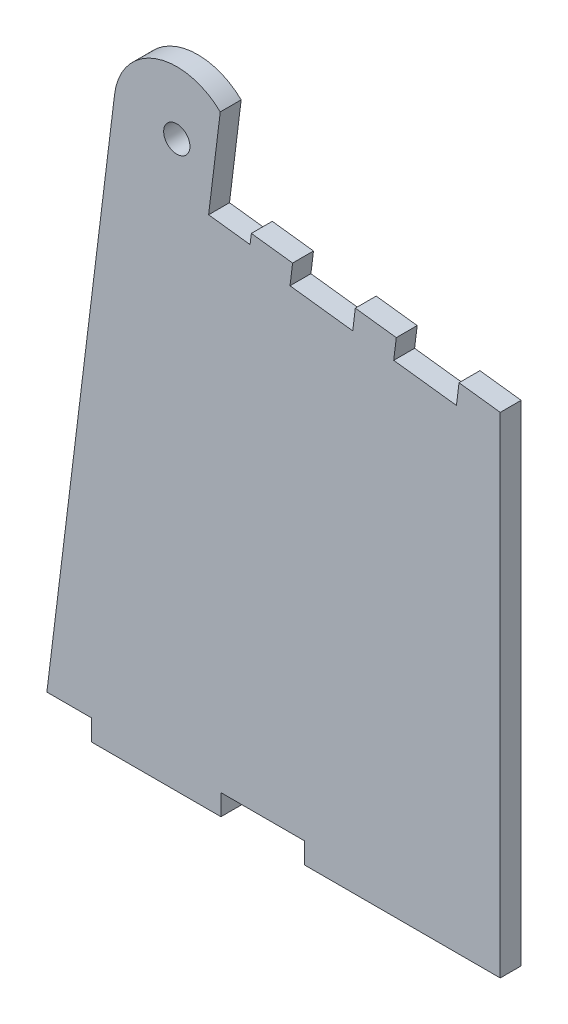
ISO-10303-21;
HEADER;
FILE_DESCRIPTION(('STEP AP214'),'2;1');
FILE_NAME('part.step','',(''),(''),'','','');
FILE_SCHEMA(('AUTOMOTIVE_DESIGN { 1 0 10303 214 1 1 1 1 }'));
ENDSEC;
DATA;
#1=APPLICATION_CONTEXT('core data for automotive mechanical design processes');
#2=APPLICATION_PROTOCOL_DEFINITION('international standard','automotive_design',2000,#1);
#3=PRODUCT_CONTEXT('',#1,'mechanical');
#4=PRODUCT('Part','Part','',(#3));
#5=PRODUCT_RELATED_PRODUCT_CATEGORY('part','',(#4));
#6=PRODUCT_DEFINITION_FORMATION('','',#4);
#7=PRODUCT_DEFINITION_CONTEXT('part definition',#1,'design');
#8=PRODUCT_DEFINITION('design','',#6,#7);
#9=PRODUCT_DEFINITION_SHAPE('','',#8);
#10=(LENGTH_UNIT() NAMED_UNIT(*) SI_UNIT(.MILLI.,.METRE.));
#11=(NAMED_UNIT(*) PLANE_ANGLE_UNIT() SI_UNIT($,.RADIAN.));
#12=(NAMED_UNIT(*) SI_UNIT($,.STERADIAN.) SOLID_ANGLE_UNIT());
#13=UNCERTAINTY_MEASURE_WITH_UNIT(LENGTH_MEASURE(1.E-05),#10,'distance_accuracy_value','');
#14=(GEOMETRIC_REPRESENTATION_CONTEXT(3) GLOBAL_UNCERTAINTY_ASSIGNED_CONTEXT((#13)) GLOBAL_UNIT_ASSIGNED_CONTEXT((#10,
#11,#12)) REPRESENTATION_CONTEXT('',''));
#15=CARTESIAN_POINT('',(0.,0.,0.));
#16=DIRECTION('',(0.,0.,1.));
#17=DIRECTION('',(1.,0.,0.));
#18=AXIS2_PLACEMENT_3D('',#15,#16,#17);
#19=CARTESIAN_POINT('',(-3.24017424080593,0.397843371406262,6.35));
#20=DIRECTION('',(0.992546151641322,-0.121869343405149,0.));
#21=DIRECTION('',(0.121869343405149,0.992546151641322,0.));
#22=AXIS2_PLACEMENT_3D('',#19,#20,#21);
#23=PLANE('',#22);
#24=DIRECTION('',(-0.121869343405149,-0.992546151641322,0.));
#25=VECTOR('',#24,1.);
#26=CARTESIAN_POINT('',(-3.24017424080593,0.397843371406262,0.));
#27=LINE('',#26,#25);
#28=CARTESIAN_POINT('',(19.4740695694599,185.390513811687,0.));
#29=VERTEX_POINT('',#28);
#30=CARTESIAN_POINT('',(15.9319371033892,156.542159914232,0.));
#31=VERTEX_POINT('',#30);
#32=EDGE_CURVE('E227',#29,#31,#27,.T.);
#33=ORIENTED_EDGE('',*,*,#32,.F.);
#34=DIRECTION('',(0.,0.,-1.));
#35=VECTOR('',#34,1.);
#36=CARTESIAN_POINT('',(19.4740695694599,185.390513811687,6.35));
#37=LINE('',#36,#35);
#38=CARTESIAN_POINT('',(19.4740695694599,185.390513811687,6.35));
#39=VERTEX_POINT('',#38);
#40=EDGE_CURVE('E12',#39,#29,#37,.T.);
#41=ORIENTED_EDGE('',*,*,#40,.F.);
#42=DIRECTION('',(-0.121869343405149,-0.992546151641322,0.));
#43=VECTOR('',#42,1.);
#44=CARTESIAN_POINT('',(-3.24017424080593,0.397843371406262,6.35));
#45=LINE('',#44,#43);
#46=CARTESIAN_POINT('',(15.9319371033892,156.542159914232,6.35));
#47=VERTEX_POINT('',#46);
#48=EDGE_CURVE('E421',#39,#47,#45,.T.);
#49=ORIENTED_EDGE('',*,*,#48,.T.);
#50=DIRECTION('',(0.,0.,-1.));
#51=VECTOR('',#50,1.);
#52=CARTESIAN_POINT('',(15.9319371033892,156.542159914232,6.35));
#53=LINE('',#52,#51);
#54=EDGE_CURVE('E59',#47,#31,#53,.T.);
#55=ORIENTED_EDGE('',*,*,#54,.T.);
#56=EDGE_LOOP('',(#33,#41,#49,#55));
#57=FACE_BOUND('',#56,.T.);
#58=ADVANCED_FACE('F42',(#57),#23,.T.);
#59=CARTESIAN_POINT('',(6.27197826270509,171.657077055794,6.35));
#60=DIRECTION('',(0.,0.,-1.));
#61=DIRECTION('',(-1.,0.,0.));
#62=AXIS2_PLACEMENT_3D('',#59,#60,#61);
#63=CYLINDRICAL_SURFACE('',#62,19.05);
#64=CARTESIAN_POINT('',(6.27197826270509,171.657077055794,0.));
#65=DIRECTION('',(0.,0.,1.));
#66=DIRECTION('',(1.,0.,0.));
#67=AXIS2_PLACEMENT_3D('',#64,#65,#66);
#68=CIRCLE('',#67,19.05);
#69=CARTESIAN_POINT('',(-12.6360259260621,173.978688047662,0.));
#70=VERTEX_POINT('',#69);
#71=EDGE_CURVE('E229',#29,#70,#68,.T.);
#72=ORIENTED_EDGE('',*,*,#71,.T.);
#73=DIRECTION('',(0.,0.,-1.));
#74=VECTOR('',#73,1.);
#75=CARTESIAN_POINT('',(-12.6360259260621,173.978688047662,6.35));
#76=LINE('',#75,#74);
#77=CARTESIAN_POINT('',(-12.6360259260621,173.978688047662,6.35));
#78=VERTEX_POINT('',#77);
#79=EDGE_CURVE('E51',#78,#70,#76,.T.);
#80=ORIENTED_EDGE('',*,*,#79,.F.);
#81=CARTESIAN_POINT('',(6.27197826270509,171.657077055794,6.35));
#82=DIRECTION('',(0.,0.,1.));
#83=DIRECTION('',(1.,0.,0.));
#84=AXIS2_PLACEMENT_3D('',#81,#82,#83);
#85=CIRCLE('',#84,19.05);
#86=EDGE_CURVE('E423',#39,#78,#85,.T.);
#87=ORIENTED_EDGE('',*,*,#86,.F.);
#88=ORIENTED_EDGE('',*,*,#40,.T.);
#89=EDGE_LOOP('',(#72,#80,#87,#88));
#90=FACE_BOUND('',#89,.T.);
#91=ADVANCED_FACE('F335',(#90),#63,.T.);
#92=CARTESIAN_POINT('',(-33.4929809428334,4.11242095839518,6.35));
#93=DIRECTION('',(0.992546151641322,-0.121869343405148,0.));
#94=DIRECTION('',(0.121869343405148,0.992546151641322,0.));
#95=AXIS2_PLACEMENT_3D('',#92,#93,#94);
#96=PLANE('',#95);
#97=DIRECTION('',(-0.121869343405148,-0.992546151641322,0.));
#98=VECTOR('',#97,1.);
#99=CARTESIAN_POINT('',(-33.4929809428334,4.11242095839518,0.));
#100=LINE('',#99,#98);
#101=CARTESIAN_POINT('',(-33.2182407827244,6.35,0.));
#102=VERTEX_POINT('',#101);
#103=EDGE_CURVE('E232',#70,#102,#100,.T.);
#104=ORIENTED_EDGE('',*,*,#103,.T.);
#105=DIRECTION('',(0.,0.,-1.));
#106=VECTOR('',#105,1.);
#107=CARTESIAN_POINT('',(-33.2182407827244,6.35,6.35));
#108=LINE('',#107,#106);
#109=CARTESIAN_POINT('',(-33.2182407827244,6.35,6.35));
#110=VERTEX_POINT('',#109);
#111=EDGE_CURVE('E323',#110,#102,#108,.T.);
#112=ORIENTED_EDGE('',*,*,#111,.F.);
#113=DIRECTION('',(-0.121869343405148,-0.992546151641322,0.));
#114=VECTOR('',#113,1.);
#115=CARTESIAN_POINT('',(-33.4929809428334,4.11242095839518,6.35));
#116=LINE('',#115,#114);
#117=EDGE_CURVE('E331',#78,#110,#116,.T.);
#118=ORIENTED_EDGE('',*,*,#117,.F.);
#119=ORIENTED_EDGE('',*,*,#79,.T.);
#120=EDGE_LOOP('',(#104,#112,#118,#119));
#121=FACE_BOUND('',#120,.T.);
#122=ADVANCED_FACE('F328',(#121),#96,.F.);
#123=CARTESIAN_POINT('',(0.,6.35,6.35));
#124=DIRECTION('',(0.,1.,0.));
#125=DIRECTION('',(0.,0.,1.));
#126=AXIS2_PLACEMENT_3D('',#123,#124,#125);
#127=PLANE('',#126);
#128=DIRECTION('',(1.,0.,0.));
#129=VECTOR('',#128,1.);
#130=CARTESIAN_POINT('',(0.,6.35,0.));
#131=LINE('',#130,#129);
#132=CARTESIAN_POINT('',(-19.685,6.35,0.));
#133=VERTEX_POINT('',#132);
#134=EDGE_CURVE('E235',#102,#133,#131,.T.);
#135=ORIENTED_EDGE('',*,*,#134,.T.);
#136=DIRECTION('',(0.,0.,-1.));
#137=VECTOR('',#136,1.);
#138=CARTESIAN_POINT('',(-19.685,6.35,6.35));
#139=LINE('',#138,#137);
#140=CARTESIAN_POINT('',(-19.685,6.35,6.35));
#141=VERTEX_POINT('',#140);
#142=EDGE_CURVE('E320',#141,#133,#139,.T.);
#143=ORIENTED_EDGE('',*,*,#142,.F.);
#144=DIRECTION('',(1.,0.,0.));
#145=VECTOR('',#144,1.);
#146=CARTESIAN_POINT('',(0.,6.35,6.35));
#147=LINE('',#146,#145);
#148=EDGE_CURVE('E428',#110,#141,#147,.T.);
#149=ORIENTED_EDGE('',*,*,#148,.F.);
#150=ORIENTED_EDGE('',*,*,#111,.T.);
#151=EDGE_LOOP('',(#135,#143,#149,#150));
#152=FACE_BOUND('',#151,.T.);
#153=ADVANCED_FACE('F346',(#152),#127,.F.);
#154=CARTESIAN_POINT('',(-19.685,0.,6.35));
#155=DIRECTION('',(1.,0.,0.));
#156=DIRECTION('',(0.,0.,-1.));
#157=AXIS2_PLACEMENT_3D('',#154,#155,#156);
#158=PLANE('',#157);
#159=DIRECTION('',(0.,-1.,0.));
#160=VECTOR('',#159,1.);
#161=CARTESIAN_POINT('',(-19.685,0.,0.));
#162=LINE('',#161,#160);
#163=CARTESIAN_POINT('',(-19.685,0.,0.));
#164=VERTEX_POINT('',#163);
#165=EDGE_CURVE('E238',#133,#164,#162,.T.);
#166=ORIENTED_EDGE('',*,*,#165,.T.);
#167=DIRECTION('',(0.,0.,-1.));
#168=VECTOR('',#167,1.);
#169=CARTESIAN_POINT('',(-19.685,0.,6.35));
#170=LINE('',#169,#168);
#171=CARTESIAN_POINT('',(-19.685,0.,6.35));
#172=VERTEX_POINT('',#171);
#173=EDGE_CURVE('E318',#172,#164,#170,.T.);
#174=ORIENTED_EDGE('',*,*,#173,.F.);
#175=DIRECTION('',(0.,-1.,0.));
#176=VECTOR('',#175,1.);
#177=CARTESIAN_POINT('',(-19.685,0.,6.35));
#178=LINE('',#177,#176);
#179=EDGE_CURVE('E431',#141,#172,#178,.T.);
#180=ORIENTED_EDGE('',*,*,#179,.F.);
#181=ORIENTED_EDGE('',*,*,#142,.T.);
#182=EDGE_LOOP('',(#166,#174,#180,#181));
#183=FACE_BOUND('',#182,.T.);
#184=ADVANCED_FACE('F349',(#183),#158,.F.);
#185=CARTESIAN_POINT('',(0.,0.,6.35));
#186=DIRECTION('',(0.,-1.,0.));
#187=DIRECTION('',(1.,0.,0.));
#188=AXIS2_PLACEMENT_3D('',#185,#186,#187);
#189=PLANE('',#188);
#190=DIRECTION('',(-1.,0.,0.));
#191=VECTOR('',#190,1.);
#192=CARTESIAN_POINT('',(0.,0.,0.));
#193=LINE('',#192,#191);
#194=CARTESIAN_POINT('',(19.685,0.,0.));
#195=VERTEX_POINT('',#194);
#196=EDGE_CURVE('E241',#195,#164,#193,.T.);
#197=ORIENTED_EDGE('',*,*,#196,.F.);
#198=DIRECTION('',(0.,0.,-1.));
#199=VECTOR('',#198,1.);
#200=CARTESIAN_POINT('',(19.685,0.,6.35));
#201=LINE('',#200,#199);
#202=CARTESIAN_POINT('',(19.685,0.,6.35));
#203=VERTEX_POINT('',#202);
#204=EDGE_CURVE('E316',#203,#195,#201,.T.);
#205=ORIENTED_EDGE('',*,*,#204,.F.);
#206=DIRECTION('',(-1.,0.,0.));
#207=VECTOR('',#206,1.);
#208=CARTESIAN_POINT('',(0.,0.,6.35));
#209=LINE('',#208,#207);
#210=EDGE_CURVE('E433',#203,#172,#209,.T.);
#211=ORIENTED_EDGE('',*,*,#210,.T.);
#212=ORIENTED_EDGE('',*,*,#173,.T.);
#213=EDGE_LOOP('',(#197,#205,#211,#212));
#214=FACE_BOUND('',#213,.T.);
#215=ADVANCED_FACE('F353',(#214),#189,.T.);
#216=CARTESIAN_POINT('',(19.685,0.,6.35));
#217=DIRECTION('',(1.,0.,0.));
#218=DIRECTION('',(0.,0.,-1.));
#219=AXIS2_PLACEMENT_3D('',#216,#217,#218);
#220=PLANE('',#219);
#221=DIRECTION('',(0.,-1.,0.));
#222=VECTOR('',#221,1.);
#223=CARTESIAN_POINT('',(19.685,0.,0.));
#224=LINE('',#223,#222);
#225=CARTESIAN_POINT('',(19.685,6.35,0.));
#226=VERTEX_POINT('',#225);
#227=EDGE_CURVE('E244',#226,#195,#224,.T.);
#228=ORIENTED_EDGE('',*,*,#227,.F.);
#229=DIRECTION('',(0.,0.,-1.));
#230=VECTOR('',#229,1.);
#231=CARTESIAN_POINT('',(19.685,6.35,6.35));
#232=LINE('',#231,#230);
#233=CARTESIAN_POINT('',(19.685,6.35,6.35));
#234=VERTEX_POINT('',#233);
#235=EDGE_CURVE('E314',#234,#226,#232,.T.);
#236=ORIENTED_EDGE('',*,*,#235,.F.);
#237=DIRECTION('',(0.,-1.,0.));
#238=VECTOR('',#237,1.);
#239=CARTESIAN_POINT('',(19.685,0.,6.35));
#240=LINE('',#239,#238);
#241=EDGE_CURVE('E436',#234,#203,#240,.T.);
#242=ORIENTED_EDGE('',*,*,#241,.T.);
#243=ORIENTED_EDGE('',*,*,#204,.T.);
#244=EDGE_LOOP('',(#228,#236,#242,#243));
#245=FACE_BOUND('',#244,.T.);
#246=ADVANCED_FACE('F357',(#245),#220,.T.);
#247=CARTESIAN_POINT('',(0.,6.35,6.35));
#248=DIRECTION('',(0.,-1.,0.));
#249=DIRECTION('',(0.,0.,-1.));
#250=AXIS2_PLACEMENT_3D('',#247,#248,#249);
#251=PLANE('',#250);
#252=DIRECTION('',(-1.,0.,0.));
#253=VECTOR('',#252,1.);
#254=CARTESIAN_POINT('',(0.,6.35,0.));
#255=LINE('',#254,#253);
#256=CARTESIAN_POINT('',(45.085,6.35,0.));
#257=VERTEX_POINT('',#256);
#258=EDGE_CURVE('E247',#257,#226,#255,.T.);
#259=ORIENTED_EDGE('',*,*,#258,.F.);
#260=DIRECTION('',(0.,0.,-1.));
#261=VECTOR('',#260,1.);
#262=CARTESIAN_POINT('',(45.085,6.35,6.35));
#263=LINE('',#262,#261);
#264=CARTESIAN_POINT('',(45.085,6.35,6.35));
#265=VERTEX_POINT('',#264);
#266=EDGE_CURVE('E312',#265,#257,#263,.T.);
#267=ORIENTED_EDGE('',*,*,#266,.F.);
#268=DIRECTION('',(-1.,0.,0.));
#269=VECTOR('',#268,1.);
#270=CARTESIAN_POINT('',(0.,6.35,6.35));
#271=LINE('',#270,#269);
#272=EDGE_CURVE('E439',#265,#234,#271,.T.);
#273=ORIENTED_EDGE('',*,*,#272,.T.);
#274=ORIENTED_EDGE('',*,*,#235,.T.);
#275=EDGE_LOOP('',(#259,#267,#273,#274));
#276=FACE_BOUND('',#275,.T.);
#277=ADVANCED_FACE('F361',(#276),#251,.T.);
#278=CARTESIAN_POINT('',(45.085,0.,6.35));
#279=DIRECTION('',(-1.,0.,0.));
#280=DIRECTION('',(0.,0.,1.));
#281=AXIS2_PLACEMENT_3D('',#278,#279,#280);
#282=PLANE('',#281);
#283=DIRECTION('',(0.,1.,0.));
#284=VECTOR('',#283,1.);
#285=CARTESIAN_POINT('',(45.085,0.,0.));
#286=LINE('',#285,#284);
#287=CARTESIAN_POINT('',(45.085,0.,0.));
#288=VERTEX_POINT('',#287);
#289=EDGE_CURVE('E250',#288,#257,#286,.T.);
#290=ORIENTED_EDGE('',*,*,#289,.F.);
#291=DIRECTION('',(0.,0.,-1.));
#292=VECTOR('',#291,1.);
#293=CARTESIAN_POINT('',(45.085,0.,6.35));
#294=LINE('',#293,#292);
#295=CARTESIAN_POINT('',(45.085,0.,6.35));
#296=VERTEX_POINT('',#295);
#297=EDGE_CURVE('E310',#296,#288,#294,.T.);
#298=ORIENTED_EDGE('',*,*,#297,.F.);
#299=DIRECTION('',(0.,1.,0.));
#300=VECTOR('',#299,1.);
#301=CARTESIAN_POINT('',(45.085,0.,6.35));
#302=LINE('',#301,#300);
#303=EDGE_CURVE('E442',#296,#265,#302,.T.);
#304=ORIENTED_EDGE('',*,*,#303,.T.);
#305=ORIENTED_EDGE('',*,*,#266,.T.);
#306=EDGE_LOOP('',(#290,#298,#304,#305));
#307=FACE_BOUND('',#306,.T.);
#308=ADVANCED_FACE('F365',(#307),#282,.T.);
#309=CARTESIAN_POINT('',(0.,0.,6.35));
#310=DIRECTION('',(0.,1.,0.));
#311=DIRECTION('',(-1.,0.,0.));
#312=AXIS2_PLACEMENT_3D('',#309,#310,#311);
#313=PLANE('',#312);
#314=DIRECTION('',(1.,0.,0.));
#315=VECTOR('',#314,1.);
#316=CARTESIAN_POINT('',(0.,0.,0.));
#317=LINE('',#316,#315);
#318=CARTESIAN_POINT('',(104.556225149614,0.,0.));
#319=VERTEX_POINT('',#318);
#320=EDGE_CURVE('E253',#288,#319,#317,.T.);
#321=ORIENTED_EDGE('',*,*,#320,.T.);
#322=DIRECTION('',(0.,0.,-1.));
#323=VECTOR('',#322,1.);
#324=CARTESIAN_POINT('',(104.556225149614,0.,6.35));
#325=LINE('',#324,#323);
#326=CARTESIAN_POINT('',(104.556225149614,0.,6.35));
#327=VERTEX_POINT('',#326);
#328=EDGE_CURVE('E308',#327,#319,#325,.T.);
#329=ORIENTED_EDGE('',*,*,#328,.F.);
#330=DIRECTION('',(1.,0.,0.));
#331=VECTOR('',#330,1.);
#332=CARTESIAN_POINT('',(0.,0.,6.35));
#333=LINE('',#332,#331);
#334=EDGE_CURVE('E445',#296,#327,#333,.T.);
#335=ORIENTED_EDGE('',*,*,#334,.F.);
#336=ORIENTED_EDGE('',*,*,#297,.T.);
#337=EDGE_LOOP('',(#321,#329,#335,#336));
#338=FACE_BOUND('',#337,.T.);
#339=ADVANCED_FACE('F369',(#338),#313,.F.);
#340=CARTESIAN_POINT('',(104.556225149614,0.,6.35));
#341=DIRECTION('',(1.,0.,0.));
#342=DIRECTION('',(0.,0.,-1.));
#343=AXIS2_PLACEMENT_3D('',#340,#341,#342);
#344=PLANE('',#343);
#345=DIRECTION('',(0.,-1.,0.));
#346=VECTOR('',#345,1.);
#347=CARTESIAN_POINT('',(104.556225149614,0.,0.));
#348=LINE('',#347,#346);
#349=CARTESIAN_POINT('',(104.556225149614,148.859309316975,0.));
#350=VERTEX_POINT('',#349);
#351=EDGE_CURVE('E256',#350,#319,#348,.T.);
#352=ORIENTED_EDGE('',*,*,#351,.F.);
#353=DIRECTION('',(0.,0.,-1.));
#354=VECTOR('',#353,1.);
#355=CARTESIAN_POINT('',(104.556225149614,148.859309316975,6.35));
#356=LINE('',#355,#354);
#357=CARTESIAN_POINT('',(104.556225149614,148.859309316975,6.35));
#358=VERTEX_POINT('',#357);
#359=EDGE_CURVE('E306',#358,#350,#356,.T.);
#360=ORIENTED_EDGE('',*,*,#359,.F.);
#361=DIRECTION('',(0.,-1.,0.));
#362=VECTOR('',#361,1.);
#363=CARTESIAN_POINT('',(104.556225149614,0.,6.35));
#364=LINE('',#363,#362);
#365=EDGE_CURVE('E447',#358,#327,#364,.T.);
#366=ORIENTED_EDGE('',*,*,#365,.T.);
#367=ORIENTED_EDGE('',*,*,#328,.T.);
#368=EDGE_LOOP('',(#352,#360,#366,#367));
#369=FACE_BOUND('',#368,.T.);
#370=ADVANCED_FACE('F373',(#369),#344,.T.);
#371=CARTESIAN_POINT('',(19.5590465095066,159.295650574287,6.35));
#372=DIRECTION('',(0.121869343405149,0.992546151641322,0.));
#373=DIRECTION('',(-0.992546151641322,0.121869343405149,0.));
#374=AXIS2_PLACEMENT_3D('',#371,#372,#373);
#375=PLANE('',#374);
#376=DIRECTION('',(0.992546151641322,-0.121869343405149,0.));
#377=VECTOR('',#376,1.);
#378=CARTESIAN_POINT('',(19.5590465095066,159.295650574287,0.));
#379=LINE('',#378,#377);
#380=CARTESIAN_POINT('',(92.0265210405244,150.397763534253,0.));
#381=VERTEX_POINT('',#380);
#382=EDGE_CURVE('E259',#381,#350,#379,.T.);
#383=ORIENTED_EDGE('',*,*,#382,.F.);
#384=DIRECTION('',(0.,0.,-1.));
#385=VECTOR('',#384,1.);
#386=CARTESIAN_POINT('',(92.0265210405244,150.397763534253,6.35));
#387=LINE('',#386,#385);
#388=CARTESIAN_POINT('',(92.0265210405244,150.397763534253,6.35));
#389=VERTEX_POINT('',#388);
#390=EDGE_CURVE('E304',#389,#381,#387,.T.);
#391=ORIENTED_EDGE('',*,*,#390,.F.);
#392=DIRECTION('',(0.992546151641322,-0.121869343405149,0.));
#393=VECTOR('',#392,1.);
#394=CARTESIAN_POINT('',(19.5590465095066,159.295650574287,6.35));
#395=LINE('',#394,#393);
#396=EDGE_CURVE('E216',#389,#358,#395,.T.);
#397=ORIENTED_EDGE('',*,*,#396,.T.);
#398=ORIENTED_EDGE('',*,*,#359,.T.);
#399=EDGE_LOOP('',(#383,#391,#397,#398));
#400=FACE_BOUND('',#399,.T.);
#401=ADVANCED_FACE('F377',(#400),#375,.T.);
#402=CARTESIAN_POINT('',(72.467474531018,-8.89788704003351,6.35));
#403=DIRECTION('',(0.992546151641322,-0.121869343405148,0.));
#404=DIRECTION('',(0.121869343405148,0.992546151641322,0.));
#405=AXIS2_PLACEMENT_3D('',#402,#403,#404);
#406=PLANE('',#405);
#407=DIRECTION('',(-0.121869343405148,-0.992546151641322,0.));
#408=VECTOR('',#407,1.);
#409=CARTESIAN_POINT('',(72.467474531018,-8.89788704003351,0.));
#410=LINE('',#409,#408);
#411=CARTESIAN_POINT('',(91.2433642659342,144.019463454576,0.));
#412=VERTEX_POINT('',#411);
#413=EDGE_CURVE('E262',#381,#412,#410,.T.);
#414=ORIENTED_EDGE('',*,*,#413,.T.);
#415=DIRECTION('',(0.,0.,-1.));
#416=VECTOR('',#415,1.);
#417=CARTESIAN_POINT('',(91.2433642659342,144.019463454576,6.35));
#418=LINE('',#417,#416);
#419=CARTESIAN_POINT('',(91.2433642659342,144.019463454576,6.35));
#420=VERTEX_POINT('',#419);
#421=EDGE_CURVE('E301',#420,#412,#418,.T.);
#422=ORIENTED_EDGE('',*,*,#421,.F.);
#423=DIRECTION('',(-0.121869343405148,-0.992546151641322,0.));
#424=VECTOR('',#423,1.);
#425=CARTESIAN_POINT('',(72.467474531018,-8.89788704003351,6.35));
#426=LINE('',#425,#424);
#427=EDGE_CURVE('E451',#389,#420,#426,.T.);
#428=ORIENTED_EDGE('',*,*,#427,.F.);
#429=ORIENTED_EDGE('',*,*,#390,.T.);
#430=EDGE_LOOP('',(#414,#422,#428,#429));
#431=FACE_BOUND('',#430,.T.);
#432=ADVANCED_FACE('F379',(#431),#406,.F.);
#433=CARTESIAN_POINT('',(18.7758897349164,152.917350494609,6.35));
#434=DIRECTION('',(-0.121869343405149,-0.992546151641322,0.));
#435=DIRECTION('',(0.992546151641322,-0.121869343405149,0.));
#436=AXIS2_PLACEMENT_3D('',#433,#434,#435);
#437=PLANE('',#436);
#438=DIRECTION('',(-0.992546151641322,0.121869343405149,0.));
#439=VECTOR('',#438,1.);
#440=CARTESIAN_POINT('',(18.7758897349164,152.917350494609,0.));
#441=LINE('',#440,#439);
#442=CARTESIAN_POINT('',(72.1840960436569,146.359647334379,0.));
#443=VERTEX_POINT('',#442);
#444=EDGE_CURVE('E266',#412,#443,#441,.T.);
#445=ORIENTED_EDGE('',*,*,#444,.T.);
#446=DIRECTION('',(0.,0.,-1.));
#447=VECTOR('',#446,1.);
#448=CARTESIAN_POINT('',(72.1840960436569,146.359647334379,6.35));
#449=LINE('',#448,#447);
#450=CARTESIAN_POINT('',(72.1840960436569,146.359647334379,6.35));
#451=VERTEX_POINT('',#450);
#452=EDGE_CURVE('E298',#451,#443,#449,.T.);
#453=ORIENTED_EDGE('',*,*,#452,.F.);
#454=DIRECTION('',(-0.992546151641322,0.121869343405149,0.));
#455=VECTOR('',#454,1.);
#456=CARTESIAN_POINT('',(18.7758897349164,152.917350494609,6.35));
#457=LINE('',#456,#455);
#458=EDGE_CURVE('E454',#420,#451,#457,.T.);
#459=ORIENTED_EDGE('',*,*,#458,.F.);
#460=ORIENTED_EDGE('',*,*,#421,.T.);
#461=EDGE_LOOP('',(#445,#453,#459,#460));
#462=FACE_BOUND('',#461,.T.);
#463=ADVANCED_FACE('F382',(#462),#437,.F.);
#464=CARTESIAN_POINT('',(53.4082063087406,-6.55770316023049,6.35));
#465=DIRECTION('',(-0.992546151641322,0.121869343405148,0.));
#466=DIRECTION('',(-0.121869343405148,-0.992546151641322,0.));
#467=AXIS2_PLACEMENT_3D('',#464,#465,#466);
#468=PLANE('',#467);
#469=DIRECTION('',(0.121869343405148,0.992546151641322,0.));
#470=VECTOR('',#469,1.);
#471=CARTESIAN_POINT('',(53.4082063087406,-6.55770316023049,0.));
#472=LINE('',#471,#470);
#473=CARTESIAN_POINT('',(72.967252818247,152.737947414056,0.));
#474=VERTEX_POINT('',#473);
#475=EDGE_CURVE('E269',#443,#474,#472,.T.);
#476=ORIENTED_EDGE('',*,*,#475,.T.);
#477=DIRECTION('',(0.,0.,-1.));
#478=VECTOR('',#477,1.);
#479=CARTESIAN_POINT('',(72.967252818247,152.737947414056,6.35));
#480=LINE('',#479,#478);
#481=CARTESIAN_POINT('',(72.967252818247,152.737947414056,6.35));
#482=VERTEX_POINT('',#481);
#483=EDGE_CURVE('E296',#482,#474,#480,.T.);
#484=ORIENTED_EDGE('',*,*,#483,.F.);
#485=DIRECTION('',(0.121869343405148,0.992546151641322,0.));
#486=VECTOR('',#485,1.);
#487=CARTESIAN_POINT('',(53.4082063087406,-6.55770316023049,6.35));
#488=LINE('',#487,#486);
#489=EDGE_CURVE('E457',#451,#482,#488,.T.);
#490=ORIENTED_EDGE('',*,*,#489,.F.);
#491=ORIENTED_EDGE('',*,*,#452,.T.);
#492=EDGE_LOOP('',(#476,#484,#490,#491));
#493=FACE_BOUND('',#492,.T.);
#494=ADVANCED_FACE('F386',(#493),#468,.F.);
#495=CARTESIAN_POINT('',(60.5131807259124,154.267115187367,0.));
#496=VERTEX_POINT('',#495);
#497=EDGE_CURVE('E263',#496,#474,#379,.T.);
#498=ORIENTED_EDGE('',*,*,#497,.F.);
#499=DIRECTION('',(0.,0.,-1.));
#500=VECTOR('',#499,1.);
#501=CARTESIAN_POINT('',(60.5131807259124,154.267115187367,6.35));
#502=LINE('',#501,#500);
#503=CARTESIAN_POINT('',(60.5131807259124,154.267115187367,6.35));
#504=VERTEX_POINT('',#503);
#505=EDGE_CURVE('E294',#504,#496,#502,.T.);
#506=ORIENTED_EDGE('',*,*,#505,.F.);
#507=EDGE_CURVE('E215',#504,#482,#395,.T.);
#508=ORIENTED_EDGE('',*,*,#507,.T.);
#509=ORIENTED_EDGE('',*,*,#483,.T.);
#510=EDGE_LOOP('',(#498,#506,#508,#509));
#511=FACE_BOUND('',#510,.T.);
#512=ADVANCED_FACE('F390',(#511),#375,.T.);
#513=CARTESIAN_POINT('',(40.9541342164057,-5.02853538692011,6.35));
#514=DIRECTION('',(-0.992546151641322,0.12186934340515,0.));
#515=DIRECTION('',(-0.12186934340515,-0.992546151641322,0.));
#516=AXIS2_PLACEMENT_3D('',#513,#514,#515);
#517=PLANE('',#516);
#518=DIRECTION('',(0.12186934340515,0.992546151641322,0.));
#519=VECTOR('',#518,1.);
#520=CARTESIAN_POINT('',(40.9541342164057,-5.02853538692011,0.));
#521=LINE('',#520,#519);
#522=CARTESIAN_POINT('',(59.7300239513223,147.888815107689,0.));
#523=VERTEX_POINT('',#522);
#524=EDGE_CURVE('E272',#523,#496,#521,.T.);
#525=ORIENTED_EDGE('',*,*,#524,.F.);
#526=DIRECTION('',(0.,0.,-1.));
#527=VECTOR('',#526,1.);
#528=CARTESIAN_POINT('',(59.7300239513223,147.888815107689,6.35));
#529=LINE('',#528,#527);
#530=CARTESIAN_POINT('',(59.7300239513223,147.888815107689,6.35));
#531=VERTEX_POINT('',#530);
#532=EDGE_CURVE('E292',#531,#523,#529,.T.);
#533=ORIENTED_EDGE('',*,*,#532,.F.);
#534=DIRECTION('',(0.12186934340515,0.992546151641322,0.));
#535=VECTOR('',#534,1.);
#536=CARTESIAN_POINT('',(40.9541342164057,-5.02853538692011,6.35));
#537=LINE('',#536,#535);
#538=EDGE_CURVE('E459',#531,#504,#537,.T.);
#539=ORIENTED_EDGE('',*,*,#538,.T.);
#540=ORIENTED_EDGE('',*,*,#505,.T.);
#541=EDGE_LOOP('',(#525,#533,#539,#540));
#542=FACE_BOUND('',#541,.T.);
#543=ADVANCED_FACE('F392',(#542),#517,.T.);
#544=CARTESIAN_POINT('',(18.7758897349164,152.917350494609,6.35));
#545=DIRECTION('',(0.121869343405149,0.992546151641322,0.));
#546=DIRECTION('',(-0.992546151641322,0.121869343405149,0.));
#547=AXIS2_PLACEMENT_3D('',#544,#545,#546);
#548=PLANE('',#547);
#549=DIRECTION('',(0.992546151641322,-0.121869343405149,0.));
#550=VECTOR('',#549,1.);
#551=CARTESIAN_POINT('',(18.7758897349164,152.917350494609,0.));
#552=LINE('',#551,#550);
#553=CARTESIAN_POINT('',(40.6707557290449,150.228998987492,0.));
#554=VERTEX_POINT('',#553);
#555=EDGE_CURVE('E275',#554,#523,#552,.T.);
#556=ORIENTED_EDGE('',*,*,#555,.F.);
#557=DIRECTION('',(0.,0.,-1.));
#558=VECTOR('',#557,1.);
#559=CARTESIAN_POINT('',(40.6707557290449,150.228998987492,6.35));
#560=LINE('',#559,#558);
#561=CARTESIAN_POINT('',(40.6707557290449,150.228998987492,6.35));
#562=VERTEX_POINT('',#561);
#563=EDGE_CURVE('E290',#562,#554,#560,.T.);
#564=ORIENTED_EDGE('',*,*,#563,.F.);
#565=DIRECTION('',(0.992546151641322,-0.121869343405149,0.));
#566=VECTOR('',#565,1.);
#567=CARTESIAN_POINT('',(18.7758897349164,152.917350494609,6.35));
#568=LINE('',#567,#566);
#569=EDGE_CURVE('E461',#562,#531,#568,.T.);
#570=ORIENTED_EDGE('',*,*,#569,.T.);
#571=ORIENTED_EDGE('',*,*,#532,.T.);
#572=EDGE_LOOP('',(#556,#564,#570,#571));
#573=FACE_BOUND('',#572,.T.);
#574=ADVANCED_FACE('F395',(#573),#548,.T.);
#575=CARTESIAN_POINT('',(21.8948659941283,-2.68835150711705,6.35));
#576=DIRECTION('',(0.992546151641322,-0.12186934340515,0.));
#577=DIRECTION('',(0.12186934340515,0.992546151641322,0.));
#578=AXIS2_PLACEMENT_3D('',#575,#576,#577);
#579=PLANE('',#578);
#580=DIRECTION('',(-0.12186934340515,-0.992546151641322,0.));
#581=VECTOR('',#580,1.);
#582=CARTESIAN_POINT('',(21.8948659941283,-2.68835150711705,0.));
#583=LINE('',#582,#581);
#584=CARTESIAN_POINT('',(41.4539125036351,156.60729906717,0.));
#585=VERTEX_POINT('',#584);
#586=EDGE_CURVE('E278',#585,#554,#583,.T.);
#587=ORIENTED_EDGE('',*,*,#586,.F.);
#588=DIRECTION('',(0.,0.,-1.));
#589=VECTOR('',#588,1.);
#590=CARTESIAN_POINT('',(41.4539125036351,156.60729906717,6.35));
#591=LINE('',#590,#589);
#592=CARTESIAN_POINT('',(41.4539125036351,156.60729906717,6.35));
#593=VERTEX_POINT('',#592);
#594=EDGE_CURVE('E202',#593,#585,#591,.T.);
#595=ORIENTED_EDGE('',*,*,#594,.F.);
#596=DIRECTION('',(-0.12186934340515,-0.992546151641322,0.));
#597=VECTOR('',#596,1.);
#598=CARTESIAN_POINT('',(21.8948659941283,-2.68835150711705,6.35));
#599=LINE('',#598,#597);
#600=EDGE_CURVE('E213',#593,#562,#599,.T.);
#601=ORIENTED_EDGE('',*,*,#600,.T.);
#602=ORIENTED_EDGE('',*,*,#563,.T.);
#603=EDGE_LOOP('',(#587,#595,#601,#602));
#604=FACE_BOUND('',#603,.T.);
#605=ADVANCED_FACE('F399',(#604),#579,.T.);
#606=CARTESIAN_POINT('',(28.9242083945454,158.145753284448,0.));
#607=VERTEX_POINT('',#606);
#608=EDGE_CURVE('E198',#607,#585,#379,.T.);
#609=ORIENTED_EDGE('',*,*,#608,.F.);
#610=DIRECTION('',(0.,0.,-1.));
#611=VECTOR('',#610,1.);
#612=CARTESIAN_POINT('',(28.9242083945454,158.145753284448,6.35));
#613=LINE('',#612,#611);
#614=CARTESIAN_POINT('',(28.9242083945454,158.145753284448,6.35));
#615=VERTEX_POINT('',#614);
#616=EDGE_CURVE('E193',#615,#607,#613,.T.);
#617=ORIENTED_EDGE('',*,*,#616,.F.);
#618=EDGE_CURVE('E196',#615,#593,#395,.T.);
#619=ORIENTED_EDGE('',*,*,#618,.T.);
#620=ORIENTED_EDGE('',*,*,#594,.T.);
#621=EDGE_LOOP('',(#609,#617,#619,#620));
#622=FACE_BOUND('',#621,.T.);
#623=ADVANCED_FACE('F195',(#622),#375,.T.);
#624=CARTESIAN_POINT('',(9.36516188503824,-1.14989728983909,6.35));
#625=DIRECTION('',(-0.992546151641321,0.121869343405152,0.));
#626=DIRECTION('',(-0.121869343405152,-0.992546151641322,0.));
#627=AXIS2_PLACEMENT_3D('',#624,#625,#626);
#628=PLANE('',#627);
#629=DIRECTION('',(0.121869343405152,0.992546151641321,0.));
#630=VECTOR('',#629,1.);
#631=CARTESIAN_POINT('',(9.36516188503824,-1.14989728983909,0.));
#632=LINE('',#631,#630);
#633=CARTESIAN_POINT('',(28.537273229234,154.994419252986,0.));
#634=VERTEX_POINT('',#633);
#635=EDGE_CURVE('E281',#634,#607,#632,.T.);
#636=ORIENTED_EDGE('',*,*,#635,.F.);
#637=DIRECTION('',(0.,0.,-1.));
#638=VECTOR('',#637,1.);
#639=CARTESIAN_POINT('',(28.537273229234,154.994419252986,6.35));
#640=LINE('',#639,#638);
#641=CARTESIAN_POINT('',(28.537273229234,154.994419252986,6.35));
#642=VERTEX_POINT('',#641);
#643=EDGE_CURVE('E126',#642,#634,#640,.T.);
#644=ORIENTED_EDGE('',*,*,#643,.F.);
#645=DIRECTION('',(0.121869343405152,0.992546151641321,0.));
#646=VECTOR('',#645,1.);
#647=CARTESIAN_POINT('',(9.36516188503824,-1.14989728983909,6.35));
#648=LINE('',#647,#646);
#649=EDGE_CURVE('E210',#642,#615,#648,.T.);
#650=ORIENTED_EDGE('',*,*,#649,.T.);
#651=ORIENTED_EDGE('',*,*,#616,.T.);
#652=EDGE_LOOP('',(#636,#644,#650,#651));
#653=FACE_BOUND('',#652,.T.);
#654=ADVANCED_FACE('F217',(#653),#628,.T.);
#655=CARTESIAN_POINT('',(6.27197826270509,171.657077055794,6.35));
#656=DIRECTION('',(0.,0.,-1.));
#657=DIRECTION('',(-1.,0.,0.));
#658=AXIS2_PLACEMENT_3D('',#655,#656,#657);
#659=CYLINDRICAL_SURFACE('',#658,4.00000000000001);
#660=CARTESIAN_POINT('',(6.27197826270509,171.657077055794,6.35));
#661=DIRECTION('',(0.,0.,1.));
#662=DIRECTION('',(1.,0.,0.));
#663=AXIS2_PLACEMENT_3D('',#660,#661,#662);
#664=CIRCLE('',#663,4.00000000000001);
#665=CARTESIAN_POINT('',(10.2719782627051,171.657077055794,6.35));
#666=VERTEX_POINT('',#665);
#667=EDGE_CURVE('E286',#666,#666,#664,.T.);
#668=ORIENTED_EDGE('',*,*,#667,.T.);
#669=EDGE_LOOP('',(#668));
#670=FACE_BOUND('',#669,.T.);
#671=CARTESIAN_POINT('',(6.27197826270509,171.657077055794,0.));
#672=DIRECTION('',(0.,0.,1.));
#673=DIRECTION('',(1.,0.,0.));
#674=AXIS2_PLACEMENT_3D('',#671,#672,#673);
#675=CIRCLE('',#674,4.00000000000001);
#676=CARTESIAN_POINT('',(10.2719782627051,171.657077055794,0.));
#677=VERTEX_POINT('',#676);
#678=EDGE_CURVE('E224',#677,#677,#675,.T.);
#679=ORIENTED_EDGE('',*,*,#678,.F.);
#680=EDGE_LOOP('',(#679));
#681=FACE_BOUND('',#680,.T.);
#682=ADVANCED_FACE('F44',(#670,#681),#659,.F.);
#683=CARTESIAN_POINT('',(19.1721113441951,156.144316542826,6.35));
#684=DIRECTION('',(0.121869343405148,0.992546151641322,0.));
#685=DIRECTION('',(-0.992546151641322,0.121869343405148,0.));
#686=AXIS2_PLACEMENT_3D('',#683,#684,#685);
#687=PLANE('',#686);
#688=DIRECTION('',(0.992546151641322,-0.121869343405148,0.));
#689=VECTOR('',#688,1.);
#690=CARTESIAN_POINT('',(19.1721113441951,156.144316542826,0.));
#691=LINE('',#690,#689);
#692=EDGE_CURVE('E283',#31,#634,#691,.T.);
#693=ORIENTED_EDGE('',*,*,#692,.F.);
#694=ORIENTED_EDGE('',*,*,#54,.F.);
#695=DIRECTION('',(0.992546151641322,-0.121869343405148,0.));
#696=VECTOR('',#695,1.);
#697=CARTESIAN_POINT('',(19.1721113441951,156.144316542826,6.35));
#698=LINE('',#697,#696);
#699=EDGE_CURVE('E218',#47,#642,#698,.T.);
#700=ORIENTED_EDGE('',*,*,#699,.T.);
#701=ORIENTED_EDGE('',*,*,#643,.T.);
#702=EDGE_LOOP('',(#693,#694,#700,#701));
#703=FACE_BOUND('',#702,.T.);
#704=ADVANCED_FACE('F408',(#703),#687,.T.);
#705=CARTESIAN_POINT('',(0.,0.,6.35));
#706=DIRECTION('',(0.,0.,1.));
#707=DIRECTION('',(1.,0.,0.));
#708=AXIS2_PLACEMENT_3D('',#705,#706,#707);
#709=PLANE('',#708);
#710=ORIENTED_EDGE('',*,*,#667,.F.);
#711=EDGE_LOOP('',(#710));
#712=FACE_BOUND('',#711,.T.);
#713=ORIENTED_EDGE('',*,*,#48,.F.);
#714=ORIENTED_EDGE('',*,*,#86,.T.);
#715=ORIENTED_EDGE('',*,*,#117,.T.);
#716=ORIENTED_EDGE('',*,*,#148,.T.);
#717=ORIENTED_EDGE('',*,*,#179,.T.);
#718=ORIENTED_EDGE('',*,*,#210,.F.);
#719=ORIENTED_EDGE('',*,*,#241,.F.);
#720=ORIENTED_EDGE('',*,*,#272,.F.);
#721=ORIENTED_EDGE('',*,*,#303,.F.);
#722=ORIENTED_EDGE('',*,*,#334,.T.);
#723=ORIENTED_EDGE('',*,*,#365,.F.);
#724=ORIENTED_EDGE('',*,*,#396,.F.);
#725=ORIENTED_EDGE('',*,*,#427,.T.);
#726=ORIENTED_EDGE('',*,*,#458,.T.);
#727=ORIENTED_EDGE('',*,*,#489,.T.);
#728=ORIENTED_EDGE('',*,*,#507,.F.);
#729=ORIENTED_EDGE('',*,*,#538,.F.);
#730=ORIENTED_EDGE('',*,*,#569,.F.);
#731=ORIENTED_EDGE('',*,*,#600,.F.);
#732=ORIENTED_EDGE('',*,*,#618,.F.);
#733=ORIENTED_EDGE('',*,*,#649,.F.);
#734=ORIENTED_EDGE('',*,*,#699,.F.);
#735=EDGE_LOOP('',(#713,#714,#715,#716,#717,#718,#719,#720,#721,#722,#723,#724,#725,#726,#727,
#728,#729,#730,#731,#732,#733,#734));
#736=FACE_BOUND('',#735,.T.);
#737=ADVANCED_FACE('F208',(#712,#736),#709,.T.);
#738=CARTESIAN_POINT('',(0.,0.,0.));
#739=DIRECTION('',(0.,0.,1.));
#740=DIRECTION('',(1.,0.,0.));
#741=AXIS2_PLACEMENT_3D('',#738,#739,#740);
#742=PLANE('',#741);
#743=ORIENTED_EDGE('',*,*,#678,.T.);
#744=EDGE_LOOP('',(#743));
#745=FACE_BOUND('',#744,.T.);
#746=ORIENTED_EDGE('',*,*,#32,.T.);
#747=ORIENTED_EDGE('',*,*,#692,.T.);
#748=ORIENTED_EDGE('',*,*,#635,.T.);
#749=ORIENTED_EDGE('',*,*,#608,.T.);
#750=ORIENTED_EDGE('',*,*,#586,.T.);
#751=ORIENTED_EDGE('',*,*,#555,.T.);
#752=ORIENTED_EDGE('',*,*,#524,.T.);
#753=ORIENTED_EDGE('',*,*,#497,.T.);
#754=ORIENTED_EDGE('',*,*,#475,.F.);
#755=ORIENTED_EDGE('',*,*,#444,.F.);
#756=ORIENTED_EDGE('',*,*,#413,.F.);
#757=ORIENTED_EDGE('',*,*,#382,.T.);
#758=ORIENTED_EDGE('',*,*,#351,.T.);
#759=ORIENTED_EDGE('',*,*,#320,.F.);
#760=ORIENTED_EDGE('',*,*,#289,.T.);
#761=ORIENTED_EDGE('',*,*,#258,.T.);
#762=ORIENTED_EDGE('',*,*,#227,.T.);
#763=ORIENTED_EDGE('',*,*,#196,.T.);
#764=ORIENTED_EDGE('',*,*,#165,.F.);
#765=ORIENTED_EDGE('',*,*,#134,.F.);
#766=ORIENTED_EDGE('',*,*,#103,.F.);
#767=ORIENTED_EDGE('',*,*,#71,.F.);
#768=EDGE_LOOP('',(#746,#747,#748,#749,#750,#751,#752,#753,#754,#755,#756,#757,#758,#759,#760,
#761,#762,#763,#764,#765,#766,#767));
#769=FACE_BOUND('',#768,.T.);
#770=ADVANCED_FACE('F337',(#745,#769),#742,.F.);
#771=CLOSED_SHELL('',(#58,#91,#122,#153,#184,#215,#246,#277,#308,#339,#370,#401,#432,#463,#494,
#512,#543,#574,#605,#623,#654,#682,#704,#737,#770));
#772=MANIFOLD_SOLID_BREP('B2',#771);
#773=ADVANCED_BREP_SHAPE_REPRESENTATION('',(#18,#772),#14);
#774=SHAPE_DEFINITION_REPRESENTATION(#9,#773);
ENDSEC;
END-ISO-10303-21;
